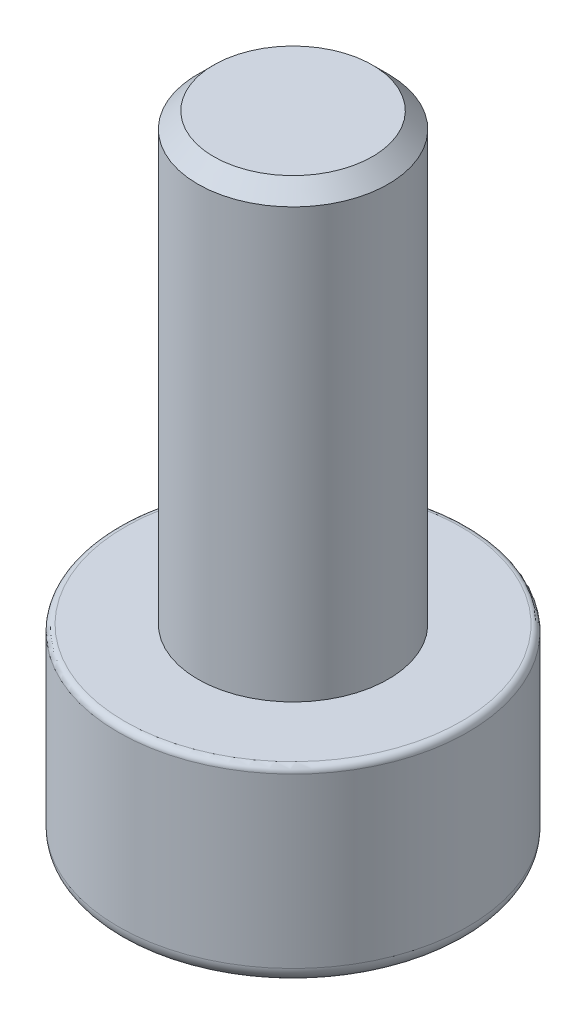
ISO-10303-21;
HEADER;
FILE_DESCRIPTION(('STEP AP214'),'2;1');
FILE_NAME('part.step','',(''),(''),'','','');
FILE_SCHEMA(('AUTOMOTIVE_DESIGN { 1 0 10303 214 1 1 1 1 }'));
ENDSEC;
DATA;
#1=APPLICATION_CONTEXT('core data for automotive mechanical design processes');
#2=APPLICATION_PROTOCOL_DEFINITION('international standard','automotive_design',2000,#1);
#3=PRODUCT_CONTEXT('',#1,'mechanical');
#4=PRODUCT('Part','Part','',(#3));
#5=PRODUCT_RELATED_PRODUCT_CATEGORY('part','',(#4));
#6=PRODUCT_DEFINITION_FORMATION('','',#4);
#7=PRODUCT_DEFINITION_CONTEXT('part definition',#1,'design');
#8=PRODUCT_DEFINITION('design','',#6,#7);
#9=PRODUCT_DEFINITION_SHAPE('','',#8);
#10=(LENGTH_UNIT() NAMED_UNIT(*) SI_UNIT(.MILLI.,.METRE.));
#11=(NAMED_UNIT(*) PLANE_ANGLE_UNIT() SI_UNIT($,.RADIAN.));
#12=(NAMED_UNIT(*) SI_UNIT($,.STERADIAN.) SOLID_ANGLE_UNIT());
#13=UNCERTAINTY_MEASURE_WITH_UNIT(LENGTH_MEASURE(1.E-05),#10,'distance_accuracy_value','');
#14=(GEOMETRIC_REPRESENTATION_CONTEXT(3) GLOBAL_UNCERTAINTY_ASSIGNED_CONTEXT((#13)) GLOBAL_UNIT_ASSIGNED_CONTEXT((#10,
#11,#12)) REPRESENTATION_CONTEXT('',''));
#15=CARTESIAN_POINT('',(0.,0.,0.));
#16=DIRECTION('',(0.,0.,1.));
#17=DIRECTION('',(1.,0.,0.));
#18=AXIS2_PLACEMENT_3D('',#15,#16,#17);
#19=CARTESIAN_POINT('',(0.,3.,0.));
#20=DIRECTION('',(0.,-1.,0.));
#21=DIRECTION('',(0.,0.,-1.));
#22=AXIS2_PLACEMENT_3D('',#19,#20,#21);
#23=CYLINDRICAL_SURFACE('',#22,2.75);
#24=CARTESIAN_POINT('',(0.,2.9,0.));
#25=DIRECTION('',(0.,1.,0.));
#26=DIRECTION('',(0.,0.,1.));
#27=AXIS2_PLACEMENT_3D('',#24,#25,#26);
#28=CIRCLE('',#27,2.75);
#29=CARTESIAN_POINT('',(0.,2.9,2.75));
#30=VERTEX_POINT('',#29);
#31=EDGE_CURVE('E11',#30,#30,#28,.F.);
#32=ORIENTED_EDGE('',*,*,#31,.T.);
#33=EDGE_LOOP('',(#32));
#34=FACE_BOUND('',#33,.T.);
#35=CARTESIAN_POINT('',(0.,0.25,0.));
#36=DIRECTION('',(0.,1.,0.));
#37=DIRECTION('',(0.,0.,1.));
#38=AXIS2_PLACEMENT_3D('',#35,#36,#37);
#39=CIRCLE('',#38,2.75);
#40=CARTESIAN_POINT('',(0.,0.25,2.75));
#41=VERTEX_POINT('',#40);
#42=EDGE_CURVE('E176',#41,#41,#39,.T.);
#43=ORIENTED_EDGE('',*,*,#42,.T.);
#44=EDGE_LOOP('',(#43));
#45=FACE_BOUND('',#44,.T.);
#46=ADVANCED_FACE('F32',(#34,#45),#23,.T.);
#47=CARTESIAN_POINT('',(0.,3.,0.));
#48=DIRECTION('',(0.,1.,0.));
#49=DIRECTION('',(0.,0.,1.));
#50=AXIS2_PLACEMENT_3D('',#47,#48,#49);
#51=PLANE('',#50);
#52=CARTESIAN_POINT('',(0.,3.,0.));
#53=DIRECTION('',(0.,1.,0.));
#54=DIRECTION('',(0.,0.,1.));
#55=AXIS2_PLACEMENT_3D('',#52,#53,#54);
#56=CIRCLE('',#55,2.65);
#57=CARTESIAN_POINT('',(0.,3.,2.65));
#58=VERTEX_POINT('',#57);
#59=EDGE_CURVE('E40',#58,#58,#56,.T.);
#60=ORIENTED_EDGE('',*,*,#59,.T.);
#61=EDGE_LOOP('',(#60));
#62=FACE_BOUND('',#61,.T.);
#63=CARTESIAN_POINT('',(0.,3.,0.));
#64=DIRECTION('',(0.,1.,0.));
#65=DIRECTION('',(0.,0.,1.));
#66=AXIS2_PLACEMENT_3D('',#63,#64,#65);
#67=CIRCLE('',#66,1.5);
#68=CARTESIAN_POINT('',(0.,3.,1.5));
#69=VERTEX_POINT('',#68);
#70=EDGE_CURVE('E140',#69,#69,#67,.T.);
#71=ORIENTED_EDGE('',*,*,#70,.F.);
#72=EDGE_LOOP('',(#71));
#73=FACE_BOUND('',#72,.T.);
#74=ADVANCED_FACE('F202',(#62,#73),#51,.T.);
#75=CARTESIAN_POINT('',(0.,0.,0.));
#76=DIRECTION('',(0.,1.,0.));
#77=DIRECTION('',(0.,0.,1.));
#78=AXIS2_PLACEMENT_3D('',#75,#76,#77);
#79=PLANE('',#78);
#80=CARTESIAN_POINT('',(0.,0.,0.));
#81=DIRECTION('',(0.,1.,0.));
#82=DIRECTION('',(0.,0.,1.));
#83=AXIS2_PLACEMENT_3D('',#80,#81,#82);
#84=CIRCLE('',#83,2.5);
#85=CARTESIAN_POINT('',(0.,0.,2.5));
#86=VERTEX_POINT('',#85);
#87=EDGE_CURVE('E191',#86,#86,#84,.F.);
#88=ORIENTED_EDGE('',*,*,#87,.T.);
#89=EDGE_LOOP('',(#88));
#90=FACE_BOUND('',#89,.T.);
#91=DIRECTION('',(-0.69197693122312,0.,-0.721919612321922));
#92=VECTOR('',#91,1.);
#93=CARTESIAN_POINT('',(1.02450088015783,0.,-0.982008194523007));
#94=LINE('',#93,#92);
#95=CARTESIAN_POINT('',(1.59146357561211,0.,-0.390512335578876));
#96=VERTEX_POINT('',#95);
#97=CARTESIAN_POINT('',(0.457538184703553,0.,-1.57350405346714));
#98=VERTEX_POINT('',#97);
#99=EDGE_CURVE('E155',#96,#98,#94,.T.);
#100=ORIENTED_EDGE('',*,*,#99,.T.);
#101=DIRECTION('',(-0.971189189372558,0.,0.238309795111058));
#102=VECTOR('',#101,1.);
#103=CARTESIAN_POINT('',(-0.3381936031025,0.,-1.3782478856777));
#104=LINE('',#103,#102);
#105=CARTESIAN_POINT('',(-1.13392539090855,0.,-1.18299171788826));
#106=VERTEX_POINT('',#105);
#107=EDGE_CURVE('E165',#98,#106,#104,.T.);
#108=ORIENTED_EDGE('',*,*,#107,.T.);
#109=DIRECTION('',(-0.279212258149438,0.,0.96022940743298));
#110=VECTOR('',#109,1.);
#111=CARTESIAN_POINT('',(-1.36269448326033,0.,-0.396239691154693));
#112=LINE('',#111,#110);
#113=CARTESIAN_POINT('',(-1.5914635756121,0.,0.390512335578876));
#114=VERTEX_POINT('',#113);
#115=EDGE_CURVE('E163',#106,#114,#112,.T.);
#116=ORIENTED_EDGE('',*,*,#115,.T.);
#117=DIRECTION('',(0.69197693122312,0.,0.721919612321922));
#118=VECTOR('',#117,1.);
#119=CARTESIAN_POINT('',(-1.02450088015783,0.,0.982008194523007));
#120=LINE('',#119,#118);
#121=CARTESIAN_POINT('',(-0.457538184703552,0.,1.57350405346714));
#122=VERTEX_POINT('',#121);
#123=EDGE_CURVE('E161',#114,#122,#120,.T.);
#124=ORIENTED_EDGE('',*,*,#123,.T.);
#125=DIRECTION('',(0.971189189372558,0.,-0.238309795111058));
#126=VECTOR('',#125,1.);
#127=CARTESIAN_POINT('',(0.3381936031025,0.,1.3782478856777));
#128=LINE('',#127,#126);
#129=CARTESIAN_POINT('',(1.13392539090855,0.,1.18299171788826));
#130=VERTEX_POINT('',#129);
#131=EDGE_CURVE('E159',#122,#130,#128,.T.);
#132=ORIENTED_EDGE('',*,*,#131,.T.);
#133=DIRECTION('',(0.279212258149438,0.,-0.96022940743298));
#134=VECTOR('',#133,1.);
#135=CARTESIAN_POINT('',(1.36269448326033,0.,0.396239691154693));
#136=LINE('',#135,#134);
#137=EDGE_CURVE('E157',#130,#96,#136,.T.);
#138=ORIENTED_EDGE('',*,*,#137,.T.);
#139=EDGE_LOOP('',(#100,#108,#116,#124,#132,#138));
#140=FACE_BOUND('',#139,.T.);
#141=ADVANCED_FACE('F220',(#90,#140),#79,.F.);
#142=CARTESIAN_POINT('',(0.,10.,0.));
#143=DIRECTION('',(0.,-1.,0.));
#144=DIRECTION('',(0.,0.,-1.));
#145=AXIS2_PLACEMENT_3D('',#142,#143,#144);
#146=CYLINDRICAL_SURFACE('',#145,1.5);
#147=CARTESIAN_POINT('',(0.,9.75,0.));
#148=DIRECTION('',(0.,1.,0.));
#149=DIRECTION('',(0.,0.,1.));
#150=AXIS2_PLACEMENT_3D('',#147,#148,#149);
#151=CIRCLE('',#150,1.5);
#152=CARTESIAN_POINT('',(0.,9.75,1.5));
#153=VERTEX_POINT('',#152);
#154=EDGE_CURVE('E197',#153,#153,#151,.F.);
#155=ORIENTED_EDGE('',*,*,#154,.T.);
#156=EDGE_LOOP('',(#155));
#157=FACE_BOUND('',#156,.T.);
#158=ORIENTED_EDGE('',*,*,#70,.T.);
#159=EDGE_LOOP('',(#158));
#160=FACE_BOUND('',#159,.T.);
#161=ADVANCED_FACE('F259',(#157,#160),#146,.T.);
#162=CARTESIAN_POINT('',(0.,10.,0.));
#163=DIRECTION('',(0.,1.,0.));
#164=DIRECTION('',(0.,0.,1.));
#165=AXIS2_PLACEMENT_3D('',#162,#163,#164);
#166=PLANE('',#165);
#167=CARTESIAN_POINT('',(0.,10.,0.));
#168=DIRECTION('',(0.,1.,0.));
#169=DIRECTION('',(0.,0.,1.));
#170=AXIS2_PLACEMENT_3D('',#167,#168,#169);
#171=CIRCLE('',#170,1.25);
#172=CARTESIAN_POINT('',(0.,10.,1.25));
#173=VERTEX_POINT('',#172);
#174=EDGE_CURVE('E194',#173,#173,#171,.T.);
#175=ORIENTED_EDGE('',*,*,#174,.T.);
#176=EDGE_LOOP('',(#175));
#177=FACE_BOUND('',#176,.T.);
#178=ADVANCED_FACE('F298',(#177),#166,.T.);
#179=CARTESIAN_POINT('',(1.31110540565295,1.5,-0.321718223399928));
#180=DIRECTION('',(0.96022940743298,0.,0.279212258149438));
#181=DIRECTION('',(0.279212258149438,0.,-0.96022940743298));
#182=AXIS2_PLACEMENT_3D('',#179,#180,#181);
#183=PLANE('',#182);
#184=DIRECTION('',(0.,-1.,0.));
#185=VECTOR('',#184,1.);
#186=CARTESIAN_POINT('',(1.31110540565295,1.5,-0.321718223399928));
#187=LINE('',#186,#185);
#188=CARTESIAN_POINT('',(1.31110540565295,1.5,-0.321718223399928));
#189=VERTEX_POINT('',#188);
#190=CARTESIAN_POINT('',(1.31110540565295,0.250000000000002,-0.321718223399928));
#191=VERTEX_POINT('',#190);
#192=EDGE_CURVE('E138',#189,#191,#187,.T.);
#193=ORIENTED_EDGE('',*,*,#192,.T.);
#194=DIRECTION('',(-0.279212258149438,0.,0.96022940743298));
#195=VECTOR('',#194,1.);
#196=CARTESIAN_POINT('',(1.31110540565295,0.250000000000002,-0.321718223399928));
#197=LINE('',#196,#195);
#198=CARTESIAN_POINT('',(0.934168857151212,0.250000000000002,0.974591476634595));
#199=VERTEX_POINT('',#198);
#200=EDGE_CURVE('E54',#191,#199,#197,.T.);
#201=ORIENTED_EDGE('',*,*,#200,.T.);
#202=DIRECTION('',(0.,-1.,0.));
#203=VECTOR('',#202,1.);
#204=CARTESIAN_POINT('',(0.934168857151212,1.5,0.974591476634595));
#205=LINE('',#204,#203);
#206=CARTESIAN_POINT('',(0.934168857151212,1.5,0.974591476634595));
#207=VERTEX_POINT('',#206);
#208=EDGE_CURVE('E102',#207,#199,#205,.T.);
#209=ORIENTED_EDGE('',*,*,#208,.F.);
#210=DIRECTION('',(-0.279212258149438,0.,0.96022940743298));
#211=VECTOR('',#210,1.);
#212=CARTESIAN_POINT('',(1.31110540565295,1.5,-0.321718223399928));
#213=LINE('',#212,#211);
#214=EDGE_CURVE('E106',#189,#207,#213,.T.);
#215=ORIENTED_EDGE('',*,*,#214,.F.);
#216=EDGE_LOOP('',(#193,#201,#209,#215));
#217=FACE_BOUND('',#216,.T.);
#218=ADVANCED_FACE('F104',(#217),#183,.F.);
#219=CARTESIAN_POINT('',(0.376936548501741,1.5,-1.29630970003452));
#220=DIRECTION('',(0.721919612321922,0.,-0.69197693122312));
#221=DIRECTION('',(-0.69197693122312,0.,-0.721919612321922));
#222=AXIS2_PLACEMENT_3D('',#219,#220,#221);
#223=PLANE('',#222);
#224=DIRECTION('',(0.,-1.,0.));
#225=VECTOR('',#224,1.);
#226=CARTESIAN_POINT('',(0.376936548501741,1.5,-1.29630970003452));
#227=LINE('',#226,#225);
#228=CARTESIAN_POINT('',(0.376936548501741,1.5,-1.29630970003452));
#229=VERTEX_POINT('',#228);
#230=CARTESIAN_POINT('',(0.376936548501741,0.250000000000002,-1.29630970003452));
#231=VERTEX_POINT('',#230);
#232=EDGE_CURVE('E141',#229,#231,#227,.T.);
#233=ORIENTED_EDGE('',*,*,#232,.T.);
#234=DIRECTION('',(0.69197693122312,0.,0.721919612321922));
#235=VECTOR('',#234,1.);
#236=CARTESIAN_POINT('',(0.376936548501741,0.250000000000002,-1.29630970003452));
#237=LINE('',#236,#235);
#238=EDGE_CURVE('E47',#231,#191,#237,.T.);
#239=ORIENTED_EDGE('',*,*,#238,.T.);
#240=ORIENTED_EDGE('',*,*,#192,.F.);
#241=DIRECTION('',(0.69197693122312,0.,0.721919612321922));
#242=VECTOR('',#241,1.);
#243=CARTESIAN_POINT('',(0.376936548501741,1.5,-1.29630970003452));
#244=LINE('',#243,#242);
#245=EDGE_CURVE('E111',#229,#189,#244,.T.);
#246=ORIENTED_EDGE('',*,*,#245,.F.);
#247=EDGE_LOOP('',(#233,#239,#240,#246));
#248=FACE_BOUND('',#247,.T.);
#249=ADVANCED_FACE('F271',(#248),#223,.F.);
#250=CARTESIAN_POINT('',(-0.934168857151211,1.5,-0.974591476634595));
#251=DIRECTION('',(-0.238309795111058,0.,-0.971189189372557));
#252=DIRECTION('',(-0.971189189372558,0.,0.238309795111058));
#253=AXIS2_PLACEMENT_3D('',#250,#251,#252);
#254=PLANE('',#253);
#255=DIRECTION('',(0.,-1.,0.));
#256=VECTOR('',#255,1.);
#257=CARTESIAN_POINT('',(-0.934168857151211,1.5,-0.974591476634595));
#258=LINE('',#257,#256);
#259=CARTESIAN_POINT('',(-0.934168857151211,1.5,-0.974591476634595));
#260=VERTEX_POINT('',#259);
#261=CARTESIAN_POINT('',(-0.934168857151211,0.250000000000002,-0.974591476634595));
#262=VERTEX_POINT('',#261);
#263=EDGE_CURVE('E143',#260,#262,#258,.T.);
#264=ORIENTED_EDGE('',*,*,#263,.T.);
#265=DIRECTION('',(0.971189189372558,0.,-0.238309795111058));
#266=VECTOR('',#265,1.);
#267=CARTESIAN_POINT('',(-0.934168857151211,0.250000000000002,-0.974591476634595));
#268=LINE('',#267,#266);
#269=EDGE_CURVE('E152',#262,#231,#268,.T.);
#270=ORIENTED_EDGE('',*,*,#269,.T.);
#271=ORIENTED_EDGE('',*,*,#232,.F.);
#272=DIRECTION('',(0.971189189372558,0.,-0.238309795111058));
#273=VECTOR('',#272,1.);
#274=CARTESIAN_POINT('',(-0.934168857151211,1.5,-0.974591476634595));
#275=LINE('',#274,#273);
#276=EDGE_CURVE('E135',#260,#229,#275,.T.);
#277=ORIENTED_EDGE('',*,*,#276,.F.);
#278=EDGE_LOOP('',(#264,#270,#271,#277));
#279=FACE_BOUND('',#278,.T.);
#280=ADVANCED_FACE('F269',(#279),#254,.F.);
#281=CARTESIAN_POINT('',(-1.31110540565295,1.5,0.321718223399928));
#282=DIRECTION('',(-0.96022940743298,0.,-0.279212258149438));
#283=DIRECTION('',(-0.279212258149438,0.,0.96022940743298));
#284=AXIS2_PLACEMENT_3D('',#281,#282,#283);
#285=PLANE('',#284);
#286=DIRECTION('',(0.,-1.,0.));
#287=VECTOR('',#286,1.);
#288=CARTESIAN_POINT('',(-1.31110540565295,1.5,0.321718223399928));
#289=LINE('',#288,#287);
#290=CARTESIAN_POINT('',(-1.31110540565295,1.5,0.321718223399928));
#291=VERTEX_POINT('',#290);
#292=CARTESIAN_POINT('',(-1.31110540565295,0.250000000000002,0.321718223399928));
#293=VERTEX_POINT('',#292);
#294=EDGE_CURVE('E146',#291,#293,#289,.T.);
#295=ORIENTED_EDGE('',*,*,#294,.T.);
#296=DIRECTION('',(0.279212258149438,0.,-0.96022940743298));
#297=VECTOR('',#296,1.);
#298=CARTESIAN_POINT('',(-1.31110540565295,0.250000000000002,0.321718223399928));
#299=LINE('',#298,#297);
#300=EDGE_CURVE('E168',#293,#262,#299,.T.);
#301=ORIENTED_EDGE('',*,*,#300,.T.);
#302=ORIENTED_EDGE('',*,*,#263,.F.);
#303=DIRECTION('',(0.279212258149438,0.,-0.96022940743298));
#304=VECTOR('',#303,1.);
#305=CARTESIAN_POINT('',(-1.31110540565295,1.5,0.321718223399928));
#306=LINE('',#305,#304);
#307=EDGE_CURVE('E132',#291,#260,#306,.T.);
#308=ORIENTED_EDGE('',*,*,#307,.F.);
#309=EDGE_LOOP('',(#295,#301,#302,#308));
#310=FACE_BOUND('',#309,.T.);
#311=ADVANCED_FACE('F280',(#310),#285,.F.);
#312=CARTESIAN_POINT('',(-0.376936548501741,1.5,1.29630970003452));
#313=DIRECTION('',(-0.721919612321922,0.,0.69197693122312));
#314=DIRECTION('',(0.69197693122312,0.,0.721919612321922));
#315=AXIS2_PLACEMENT_3D('',#312,#313,#314);
#316=PLANE('',#315);
#317=DIRECTION('',(0.,-1.,0.));
#318=VECTOR('',#317,1.);
#319=CARTESIAN_POINT('',(-0.376936548501741,1.5,1.29630970003452));
#320=LINE('',#319,#318);
#321=CARTESIAN_POINT('',(-0.376936548501741,1.5,1.29630970003452));
#322=VERTEX_POINT('',#321);
#323=CARTESIAN_POINT('',(-0.376936548501741,0.250000000000002,1.29630970003452));
#324=VERTEX_POINT('',#323);
#325=EDGE_CURVE('E110',#322,#324,#320,.T.);
#326=ORIENTED_EDGE('',*,*,#325,.T.);
#327=DIRECTION('',(-0.69197693122312,0.,-0.721919612321922));
#328=VECTOR('',#327,1.);
#329=CARTESIAN_POINT('',(-0.376936548501741,0.250000000000002,1.29630970003452));
#330=LINE('',#329,#328);
#331=EDGE_CURVE('E170',#324,#293,#330,.T.);
#332=ORIENTED_EDGE('',*,*,#331,.T.);
#333=ORIENTED_EDGE('',*,*,#294,.F.);
#334=DIRECTION('',(-0.69197693122312,0.,-0.721919612321922));
#335=VECTOR('',#334,1.);
#336=CARTESIAN_POINT('',(-0.376936548501741,1.5,1.29630970003452));
#337=LINE('',#336,#335);
#338=EDGE_CURVE('E120',#322,#291,#337,.T.);
#339=ORIENTED_EDGE('',*,*,#338,.F.);
#340=EDGE_LOOP('',(#326,#332,#333,#339));
#341=FACE_BOUND('',#340,.T.);
#342=ADVANCED_FACE('F277',(#341),#316,.F.);
#343=CARTESIAN_POINT('',(0.934168857151212,1.5,0.974591476634595));
#344=DIRECTION('',(0.238309795111058,0.,0.971189189372558));
#345=DIRECTION('',(0.971189189372558,0.,-0.238309795111058));
#346=AXIS2_PLACEMENT_3D('',#343,#344,#345);
#347=PLANE('',#346);
#348=ORIENTED_EDGE('',*,*,#208,.T.);
#349=DIRECTION('',(-0.971189189372558,0.,0.238309795111058));
#350=VECTOR('',#349,1.);
#351=CARTESIAN_POINT('',(0.934168857151212,0.250000000000002,0.974591476634595));
#352=LINE('',#351,#350);
#353=EDGE_CURVE('E172',#199,#324,#352,.T.);
#354=ORIENTED_EDGE('',*,*,#353,.T.);
#355=ORIENTED_EDGE('',*,*,#325,.F.);
#356=DIRECTION('',(-0.971189189372557,0.,0.238309795111058));
#357=VECTOR('',#356,1.);
#358=CARTESIAN_POINT('',(0.934168857151212,1.5,0.974591476634595));
#359=LINE('',#358,#357);
#360=EDGE_CURVE('E114',#207,#322,#359,.T.);
#361=ORIENTED_EDGE('',*,*,#360,.F.);
#362=EDGE_LOOP('',(#348,#354,#355,#361));
#363=FACE_BOUND('',#362,.T.);
#364=ADVANCED_FACE('F115',(#363),#347,.F.);
#365=CARTESIAN_POINT('',(0.,1.5,0.));
#366=DIRECTION('',(0.,-1.,0.));
#367=DIRECTION('',(0.,0.,-1.));
#368=AXIS2_PLACEMENT_3D('',#365,#366,#367);
#369=PLANE('',#368);
#370=ORIENTED_EDGE('',*,*,#214,.T.);
#371=ORIENTED_EDGE('',*,*,#360,.T.);
#372=ORIENTED_EDGE('',*,*,#338,.T.);
#373=ORIENTED_EDGE('',*,*,#307,.T.);
#374=ORIENTED_EDGE('',*,*,#276,.T.);
#375=ORIENTED_EDGE('',*,*,#245,.T.);
#376=EDGE_LOOP('',(#370,#371,#372,#373,#374,#375));
#377=FACE_BOUND('',#376,.T.);
#378=ADVANCED_FACE('F122',(#377),#369,.T.);
#379=CARTESIAN_POINT('',(0.934168857151212,0.250000000000002,0.974591476634595));
#380=DIRECTION('',(0.168510472146206,0.707106781186547,0.686734461620402));
#381=DIRECTION('',(-0.971189189372558,0.,0.238309795111058));
#382=AXIS2_PLACEMENT_3D('',#379,#380,#381);
#383=PLANE('',#382);
#384=DIRECTION('',(-0.523085392288577,0.654653670707978,-0.545719931652561));
#385=VECTOR('',#384,1.);
#386=CARTESIAN_POINT('',(0.934168857151212,0.250000000000002,0.974591476634595));
#387=LINE('',#386,#385);
#388=EDGE_CURVE('E128',#130,#199,#387,.T.);
#389=ORIENTED_EDGE('',*,*,#388,.F.);
#390=ORIENTED_EDGE('',*,*,#131,.F.);
#391=DIRECTION('',(0.211064628018337,0.654653670707978,-0.725865203896737));
#392=VECTOR('',#391,1.);
#393=CARTESIAN_POINT('',(-0.376936548501741,0.250000000000002,1.29630970003452));
#394=LINE('',#393,#392);
#395=EDGE_CURVE('E125',#324,#122,#394,.F.);
#396=ORIENTED_EDGE('',*,*,#395,.F.);
#397=ORIENTED_EDGE('',*,*,#353,.F.);
#398=EDGE_LOOP('',(#389,#390,#396,#397));
#399=FACE_BOUND('',#398,.T.);
#400=ADVANCED_FACE('F244',(#399),#383,.F.);
#401=CARTESIAN_POINT('',(-0.376936548501741,0.250000000000002,1.29630970003452));
#402=DIRECTION('',(-0.510474253344395,0.707106781186547,0.489301580492525));
#403=DIRECTION('',(-0.69197693122312,0.,-0.721919612321922));
#404=AXIS2_PLACEMENT_3D('',#401,#402,#403);
#405=PLANE('',#404);
#406=ORIENTED_EDGE('',*,*,#395,.T.);
#407=ORIENTED_EDGE('',*,*,#123,.F.);
#408=DIRECTION('',(0.734150020306914,0.654653670707978,-0.180145272244176));
#409=VECTOR('',#408,1.);
#410=CARTESIAN_POINT('',(-1.31110540565295,0.250000000000002,0.321718223399928));
#411=LINE('',#410,#409);
#412=EDGE_CURVE('E184',#293,#114,#411,.F.);
#413=ORIENTED_EDGE('',*,*,#412,.F.);
#414=ORIENTED_EDGE('',*,*,#331,.F.);
#415=EDGE_LOOP('',(#406,#407,#413,#414));
#416=FACE_BOUND('',#415,.T.);
#417=ADVANCED_FACE('F240',(#416),#405,.F.);
#418=CARTESIAN_POINT('',(1.31110540565295,0.250000000000002,-0.321718223399928));
#419=DIRECTION('',(0.678984725490601,0.707106781186547,0.197432881127877));
#420=DIRECTION('',(-0.279212258149438,0.,0.96022940743298));
#421=AXIS2_PLACEMENT_3D('',#418,#419,#420);
#422=PLANE('',#421);
#423=ORIENTED_EDGE('',*,*,#388,.T.);
#424=ORIENTED_EDGE('',*,*,#200,.F.);
#425=DIRECTION('',(-0.734150020306914,0.654653670707978,0.180145272244176));
#426=VECTOR('',#425,1.);
#427=CARTESIAN_POINT('',(1.31110540565295,0.250000000000002,-0.321718223399928));
#428=LINE('',#427,#426);
#429=EDGE_CURVE('E181',#96,#191,#428,.T.);
#430=ORIENTED_EDGE('',*,*,#429,.F.);
#431=ORIENTED_EDGE('',*,*,#137,.F.);
#432=EDGE_LOOP('',(#423,#424,#430,#431));
#433=FACE_BOUND('',#432,.T.);
#434=ADVANCED_FACE('F236',(#433),#422,.F.);
#435=CARTESIAN_POINT('',(-1.31110540565295,0.250000000000002,0.321718223399928));
#436=DIRECTION('',(-0.678984725490601,0.707106781186547,-0.197432881127877));
#437=DIRECTION('',(0.279212258149438,0.,-0.96022940743298));
#438=AXIS2_PLACEMENT_3D('',#435,#436,#437);
#439=PLANE('',#438);
#440=ORIENTED_EDGE('',*,*,#412,.T.);
#441=ORIENTED_EDGE('',*,*,#115,.F.);
#442=DIRECTION('',(0.523085392288577,0.654653670707978,0.545719931652561));
#443=VECTOR('',#442,1.);
#444=CARTESIAN_POINT('',(-0.934168857151211,0.250000000000002,-0.974591476634595));
#445=LINE('',#444,#443);
#446=EDGE_CURVE('E179',#262,#106,#445,.F.);
#447=ORIENTED_EDGE('',*,*,#446,.F.);
#448=ORIENTED_EDGE('',*,*,#300,.F.);
#449=EDGE_LOOP('',(#440,#441,#447,#448));
#450=FACE_BOUND('',#449,.T.);
#451=ADVANCED_FACE('F232',(#450),#439,.F.);
#452=CARTESIAN_POINT('',(0.376936548501741,0.250000000000002,-1.29630970003452));
#453=DIRECTION('',(0.510474253344395,0.707106781186547,-0.489301580492525));
#454=DIRECTION('',(0.69197693122312,0.,0.721919612321922));
#455=AXIS2_PLACEMENT_3D('',#452,#453,#454);
#456=PLANE('',#455);
#457=ORIENTED_EDGE('',*,*,#429,.T.);
#458=ORIENTED_EDGE('',*,*,#238,.F.);
#459=DIRECTION('',(0.211064628018338,-0.654653670707978,-0.725865203896737));
#460=VECTOR('',#459,1.);
#461=CARTESIAN_POINT('',(0.269240391786958,0.584038370031143,-0.92593550002466));
#462=LINE('',#461,#460);
#463=EDGE_CURVE('E177',#98,#231,#462,.F.);
#464=ORIENTED_EDGE('',*,*,#463,.F.);
#465=ORIENTED_EDGE('',*,*,#99,.F.);
#466=EDGE_LOOP('',(#457,#458,#464,#465));
#467=FACE_BOUND('',#466,.T.);
#468=ADVANCED_FACE('F228',(#467),#456,.F.);
#469=CARTESIAN_POINT('',(-0.934168857151211,0.250000000000002,-0.974591476634595));
#470=DIRECTION('',(-0.168510472146206,0.707106781186547,-0.686734461620402));
#471=DIRECTION('',(0.971189189372558,0.,-0.238309795111058));
#472=AXIS2_PLACEMENT_3D('',#469,#470,#471);
#473=PLANE('',#472);
#474=ORIENTED_EDGE('',*,*,#446,.T.);
#475=ORIENTED_EDGE('',*,*,#107,.F.);
#476=ORIENTED_EDGE('',*,*,#463,.T.);
#477=ORIENTED_EDGE('',*,*,#269,.F.);
#478=EDGE_LOOP('',(#474,#475,#476,#477));
#479=FACE_BOUND('',#478,.T.);
#480=ADVANCED_FACE('F225',(#479),#473,.F.);
#481=CARTESIAN_POINT('',(0.,0.25,0.));
#482=DIRECTION('',(0.,1.,0.));
#483=DIRECTION('',(0.,0.,1.));
#484=AXIS2_PLACEMENT_3D('',#481,#482,#483);
#485=TOROIDAL_SURFACE('',#484,2.5,0.25);
#486=ORIENTED_EDGE('',*,*,#87,.F.);
#487=EDGE_LOOP('',(#486));
#488=FACE_BOUND('',#487,.T.);
#489=ORIENTED_EDGE('',*,*,#42,.F.);
#490=EDGE_LOOP('',(#489));
#491=FACE_BOUND('',#490,.T.);
#492=ADVANCED_FACE('F211',(#488,#491),#485,.T.);
#493=CARTESIAN_POINT('',(0.,10.,0.));
#494=DIRECTION('',(0.,-1.,0.));
#495=DIRECTION('',(0.,0.,-1.));
#496=AXIS2_PLACEMENT_3D('',#493,#494,#495);
#497=CONICAL_SURFACE('',#496,1.25,0.785398163397446);
#498=ORIENTED_EDGE('',*,*,#154,.F.);
#499=EDGE_LOOP('',(#498));
#500=FACE_BOUND('',#499,.T.);
#501=ORIENTED_EDGE('',*,*,#174,.F.);
#502=EDGE_LOOP('',(#501));
#503=FACE_BOUND('',#502,.T.);
#504=ADVANCED_FACE('F206',(#500,#503),#497,.T.);
#505=CARTESIAN_POINT('',(0.,2.9,0.));
#506=DIRECTION('',(0.,1.,0.));
#507=DIRECTION('',(0.,0.,1.));
#508=AXIS2_PLACEMENT_3D('',#505,#506,#507);
#509=TOROIDAL_SURFACE('',#508,2.65,0.1);
#510=ORIENTED_EDGE('',*,*,#31,.F.);
#511=EDGE_LOOP('',(#510));
#512=FACE_BOUND('',#511,.T.);
#513=ORIENTED_EDGE('',*,*,#59,.F.);
#514=EDGE_LOOP('',(#513));
#515=FACE_BOUND('',#514,.T.);
#516=ADVANCED_FACE('F34',(#512,#515),#509,.T.);
#517=CLOSED_SHELL('',(#46,#74,#141,#161,#178,#218,#249,#280,#311,#342,#364,#378,#400,#417,#434,
#451,#468,#480,#492,#504,#516));
#518=MANIFOLD_SOLID_BREP('B2',#517);
#519=ADVANCED_BREP_SHAPE_REPRESENTATION('',(#18,#518),#14);
#520=SHAPE_DEFINITION_REPRESENTATION(#9,#519);
ENDSEC;
END-ISO-10303-21;
